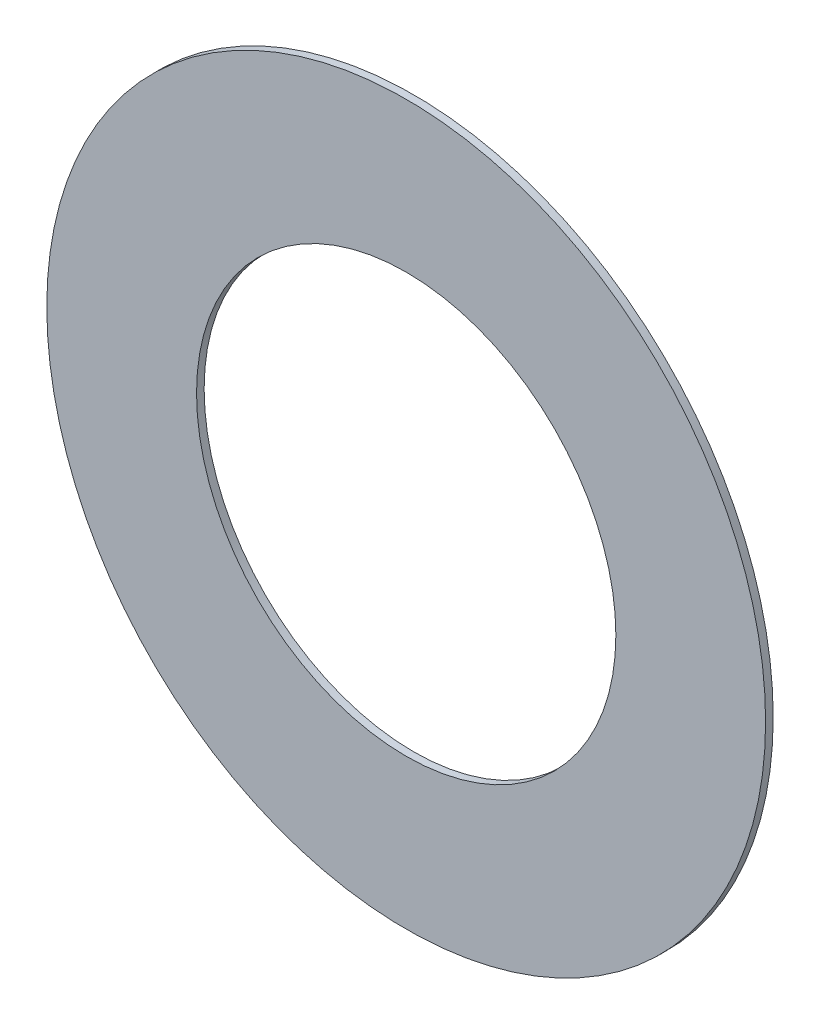
ISO-10303-21;
HEADER;
FILE_DESCRIPTION(('STEP AP214'),'2;1');
FILE_NAME('part.step','',(''),(''),'','','');
FILE_SCHEMA(('AUTOMOTIVE_DESIGN { 1 0 10303 214 1 1 1 1 }'));
ENDSEC;
DATA;
#1=APPLICATION_CONTEXT('core data for automotive mechanical design processes');
#2=APPLICATION_PROTOCOL_DEFINITION('international standard','automotive_design',2000,#1);
#3=PRODUCT_CONTEXT('',#1,'mechanical');
#4=PRODUCT('Part','Part','',(#3));
#5=PRODUCT_RELATED_PRODUCT_CATEGORY('part','',(#4));
#6=PRODUCT_DEFINITION_FORMATION('','',#4);
#7=PRODUCT_DEFINITION_CONTEXT('part definition',#1,'design');
#8=PRODUCT_DEFINITION('design','',#6,#7);
#9=PRODUCT_DEFINITION_SHAPE('','',#8);
#10=(LENGTH_UNIT() NAMED_UNIT(*) SI_UNIT(.MILLI.,.METRE.));
#11=(NAMED_UNIT(*) PLANE_ANGLE_UNIT() SI_UNIT($,.RADIAN.));
#12=(NAMED_UNIT(*) SI_UNIT($,.STERADIAN.) SOLID_ANGLE_UNIT());
#13=UNCERTAINTY_MEASURE_WITH_UNIT(LENGTH_MEASURE(1.E-05),#10,'distance_accuracy_value','');
#14=(GEOMETRIC_REPRESENTATION_CONTEXT(3) GLOBAL_UNCERTAINTY_ASSIGNED_CONTEXT((#13)) GLOBAL_UNIT_ASSIGNED_CONTEXT((#10,
#11,#12)) REPRESENTATION_CONTEXT('',''));
#15=CARTESIAN_POINT('',(0.,0.,0.));
#16=DIRECTION('',(0.,0.,1.));
#17=DIRECTION('',(1.,0.,0.));
#18=AXIS2_PLACEMENT_3D('',#15,#16,#17);
#19=CARTESIAN_POINT('',(0.,0.,0.0127));
#20=DIRECTION('',(0.,0.,1.));
#21=DIRECTION('',(1.,0.,0.));
#22=AXIS2_PLACEMENT_3D('',#19,#20,#21);
#23=PLANE('',#22);
#24=CARTESIAN_POINT('',(3.499993,1.499997,0.0127));
#25=DIRECTION('',(0.,0.,1.));
#26=DIRECTION('',(1.,0.,0.));
#27=AXIS2_PLACEMENT_3D('',#24,#25,#26);
#28=CIRCLE('',#27,0.350012);
#29=CARTESIAN_POINT('',(3.850005,1.499997,0.0127));
#30=VERTEX_POINT('',#29);
#31=EDGE_CURVE('E27',#30,#30,#28,.F.);
#32=ORIENTED_EDGE('',*,*,#31,.T.);
#33=EDGE_LOOP('',(#32));
#34=FACE_BOUND('',#33,.T.);
#35=CARTESIAN_POINT('',(3.499993,1.499997,0.0127));
#36=DIRECTION('',(0.,0.,1.));
#37=DIRECTION('',(1.,0.,0.));
#38=AXIS2_PLACEMENT_3D('',#35,#36,#37);
#39=CIRCLE('',#38,0.5999988);
#40=CARTESIAN_POINT('',(4.0999918,1.499997,0.0127));
#41=VERTEX_POINT('',#40);
#42=EDGE_CURVE('E18',#41,#41,#39,.F.);
#43=ORIENTED_EDGE('',*,*,#42,.F.);
#44=EDGE_LOOP('',(#43));
#45=FACE_BOUND('',#44,.T.);
#46=ADVANCED_FACE('F15',(#34,#45),#23,.T.);
#47=CARTESIAN_POINT('',(3.499993,1.499997,0.));
#48=DIRECTION('',(0.,0.,1.));
#49=DIRECTION('',(1.,0.,0.));
#50=AXIS2_PLACEMENT_3D('',#47,#48,#49);
#51=CYLINDRICAL_SURFACE('',#50,0.5999988);
#52=ORIENTED_EDGE('',*,*,#42,.T.);
#53=EDGE_LOOP('',(#52));
#54=FACE_BOUND('',#53,.T.);
#55=CARTESIAN_POINT('',(3.499993,1.499997,0.));
#56=DIRECTION('',(0.,0.,1.));
#57=DIRECTION('',(1.,0.,0.));
#58=AXIS2_PLACEMENT_3D('',#55,#56,#57);
#59=CIRCLE('',#58,0.5999988);
#60=CARTESIAN_POINT('',(4.0999918,1.499997,0.));
#61=VERTEX_POINT('',#60);
#62=EDGE_CURVE('E22',#61,#61,#59,.T.);
#63=ORIENTED_EDGE('',*,*,#62,.T.);
#64=EDGE_LOOP('',(#63));
#65=FACE_BOUND('',#64,.T.);
#66=ADVANCED_FACE('F35',(#54,#65),#51,.T.);
#67=CARTESIAN_POINT('',(3.499993,1.499997,0.));
#68=DIRECTION('',(0.,0.,1.));
#69=DIRECTION('',(1.,0.,0.));
#70=AXIS2_PLACEMENT_3D('',#67,#68,#69);
#71=CYLINDRICAL_SURFACE('',#70,0.350012);
#72=ORIENTED_EDGE('',*,*,#31,.F.);
#73=EDGE_LOOP('',(#72));
#74=FACE_BOUND('',#73,.T.);
#75=CARTESIAN_POINT('',(3.499993,1.499997,0.));
#76=DIRECTION('',(0.,0.,1.));
#77=DIRECTION('',(1.,0.,0.));
#78=AXIS2_PLACEMENT_3D('',#75,#76,#77);
#79=CIRCLE('',#78,0.350012);
#80=CARTESIAN_POINT('',(3.850005,1.499997,0.));
#81=VERTEX_POINT('',#80);
#82=EDGE_CURVE('E10',#81,#81,#79,.F.);
#83=ORIENTED_EDGE('',*,*,#82,.T.);
#84=EDGE_LOOP('',(#83));
#85=FACE_BOUND('',#84,.T.);
#86=ADVANCED_FACE('F43',(#74,#85),#71,.F.);
#87=CARTESIAN_POINT('',(0.,0.,0.));
#88=DIRECTION('',(0.,0.,1.));
#89=DIRECTION('',(1.,0.,0.));
#90=AXIS2_PLACEMENT_3D('',#87,#88,#89);
#91=PLANE('',#90);
#92=ORIENTED_EDGE('',*,*,#82,.F.);
#93=EDGE_LOOP('',(#92));
#94=FACE_BOUND('',#93,.T.);
#95=ORIENTED_EDGE('',*,*,#62,.F.);
#96=EDGE_LOOP('',(#95));
#97=FACE_BOUND('',#96,.T.);
#98=ADVANCED_FACE('F44',(#94,#97),#91,.F.);
#99=CLOSED_SHELL('',(#46,#66,#86,#98));
#100=MANIFOLD_SOLID_BREP('B1',#99);
#101=ADVANCED_BREP_SHAPE_REPRESENTATION('',(#18,#100),#14);
#102=SHAPE_DEFINITION_REPRESENTATION(#9,#101);
ENDSEC;
END-ISO-10303-21;
